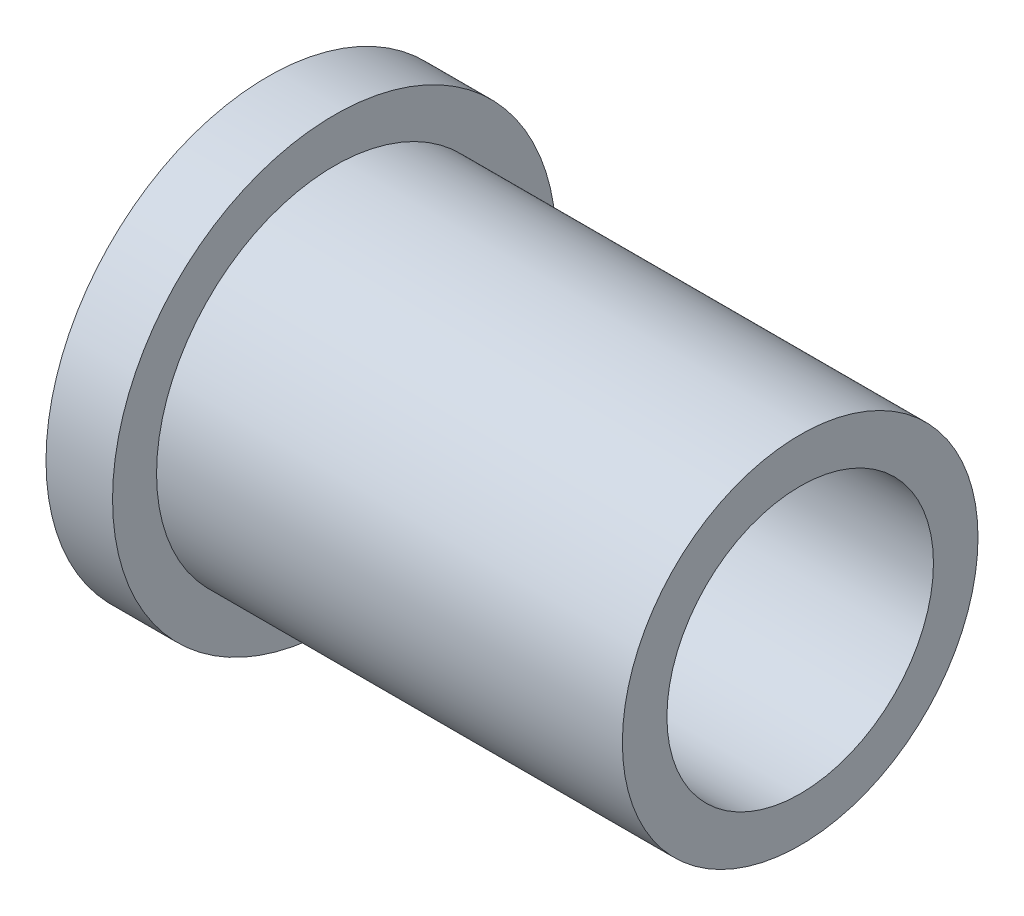
ISO-10303-21;
HEADER;
FILE_DESCRIPTION(('STEP AP214'),'2;1');
FILE_NAME('part.step','',(''),(''),'','','');
FILE_SCHEMA(('AUTOMOTIVE_DESIGN { 1 0 10303 214 1 1 1 1 }'));
ENDSEC;
DATA;
#1=APPLICATION_CONTEXT('core data for automotive mechanical design processes');
#2=APPLICATION_PROTOCOL_DEFINITION('international standard','automotive_design',2000,#1);
#3=PRODUCT_CONTEXT('',#1,'mechanical');
#4=PRODUCT('Part','Part','',(#3));
#5=PRODUCT_RELATED_PRODUCT_CATEGORY('part','',(#4));
#6=PRODUCT_DEFINITION_FORMATION('','',#4);
#7=PRODUCT_DEFINITION_CONTEXT('part definition',#1,'design');
#8=PRODUCT_DEFINITION('design','',#6,#7);
#9=PRODUCT_DEFINITION_SHAPE('','',#8);
#10=(LENGTH_UNIT() NAMED_UNIT(*) SI_UNIT(.MILLI.,.METRE.));
#11=(NAMED_UNIT(*) PLANE_ANGLE_UNIT() SI_UNIT($,.RADIAN.));
#12=(NAMED_UNIT(*) SI_UNIT($,.STERADIAN.) SOLID_ANGLE_UNIT());
#13=UNCERTAINTY_MEASURE_WITH_UNIT(LENGTH_MEASURE(1.E-05),#10,'distance_accuracy_value','');
#14=(GEOMETRIC_REPRESENTATION_CONTEXT(3) GLOBAL_UNCERTAINTY_ASSIGNED_CONTEXT((#13)) GLOBAL_UNIT_ASSIGNED_CONTEXT((#10,
#11,#12)) REPRESENTATION_CONTEXT('',''));
#15=CARTESIAN_POINT('',(0.,0.,0.));
#16=DIRECTION('',(0.,0.,1.));
#17=DIRECTION('',(1.,0.,0.));
#18=AXIS2_PLACEMENT_3D('',#15,#16,#17);
#19=CARTESIAN_POINT('',(4.7625,0.,0.));
#20=DIRECTION('',(1.,0.,0.));
#21=DIRECTION('',(0.,0.,-1.));
#22=AXIS2_PLACEMENT_3D('',#19,#20,#21);
#23=PLANE('',#22);
#24=CARTESIAN_POINT('',(4.7625,0.,0.));
#25=DIRECTION('',(1.,0.,0.));
#26=DIRECTION('',(0.,0.,-1.));
#27=AXIS2_PLACEMENT_3D('',#24,#25,#26);
#28=CIRCLE('',#27,15.875);
#29=CARTESIAN_POINT('',(4.7625,0.,15.875));
#30=VERTEX_POINT('',#29);
#31=EDGE_CURVE('E11',#30,#30,#28,.T.);
#32=ORIENTED_EDGE('',*,*,#31,.T.);
#33=EDGE_LOOP('',(#32));
#34=FACE_BOUND('',#33,.T.);
#35=CARTESIAN_POINT('',(4.7625,0.,0.));
#36=DIRECTION('',(1.,0.,0.));
#37=DIRECTION('',(0.,0.,-1.));
#38=AXIS2_PLACEMENT_3D('',#35,#36,#37);
#39=CIRCLE('',#38,12.7254);
#40=CARTESIAN_POINT('',(4.7625,0.,12.7254));
#41=VERTEX_POINT('',#40);
#42=EDGE_CURVE('E61',#41,#41,#39,.F.);
#43=ORIENTED_EDGE('',*,*,#42,.T.);
#44=EDGE_LOOP('',(#43));
#45=FACE_BOUND('',#44,.T.);
#46=ADVANCED_FACE('F46',(#34,#45),#23,.T.);
#47=CARTESIAN_POINT('',(0.,0.,0.));
#48=DIRECTION('',(1.,0.,0.));
#49=DIRECTION('',(0.,0.,-1.));
#50=AXIS2_PLACEMENT_3D('',#47,#48,#49);
#51=PLANE('',#50);
#52=CARTESIAN_POINT('',(0.,0.,0.));
#53=DIRECTION('',(1.,0.,0.));
#54=DIRECTION('',(0.,0.,-1.));
#55=AXIS2_PLACEMENT_3D('',#52,#53,#54);
#56=CIRCLE('',#55,9.5377);
#57=CARTESIAN_POINT('',(0.,0.,9.5377));
#58=VERTEX_POINT('',#57);
#59=EDGE_CURVE('E57',#58,#58,#56,.T.);
#60=ORIENTED_EDGE('',*,*,#59,.T.);
#61=EDGE_LOOP('',(#60));
#62=FACE_BOUND('',#61,.T.);
#63=CARTESIAN_POINT('',(0.,0.,0.));
#64=DIRECTION('',(1.,0.,0.));
#65=DIRECTION('',(0.,0.,-1.));
#66=AXIS2_PLACEMENT_3D('',#63,#64,#65);
#67=CIRCLE('',#66,15.875);
#68=CARTESIAN_POINT('',(0.,0.,15.875));
#69=VERTEX_POINT('',#68);
#70=EDGE_CURVE('E50',#69,#69,#67,.T.);
#71=ORIENTED_EDGE('',*,*,#70,.F.);
#72=EDGE_LOOP('',(#71));
#73=FACE_BOUND('',#72,.T.);
#74=ADVANCED_FACE('F87',(#62,#73),#51,.F.);
#75=CARTESIAN_POINT('',(4.7625,0.,0.));
#76=DIRECTION('',(-1.,0.,0.));
#77=DIRECTION('',(0.,0.,1.));
#78=AXIS2_PLACEMENT_3D('',#75,#76,#77);
#79=CYLINDRICAL_SURFACE('',#78,15.875);
#80=CARTESIAN_POINT('',(4.7625,0.,15.875));
#81=CARTESIAN_POINT('',(4.712890625,0.,15.875));
#82=CARTESIAN_POINT('',(4.66328125,0.,15.875));
#83=CARTESIAN_POINT('',(4.5640625,0.,15.875));
#84=CARTESIAN_POINT('',(4.514453125,0.,15.875));
#85=CARTESIAN_POINT('',(4.415234375,0.,15.875));
#86=CARTESIAN_POINT('',(4.365625,0.,15.875));
#87=CARTESIAN_POINT('',(4.26640625,0.,15.875));
#88=CARTESIAN_POINT('',(4.216796875,0.,15.875));
#89=CARTESIAN_POINT('',(4.117578125,0.,15.875));
#90=CARTESIAN_POINT('',(4.06796875,0.,15.875));
#91=CARTESIAN_POINT('',(3.96875,0.,15.875));
#92=CARTESIAN_POINT('',(3.919140625,0.,15.875));
#93=CARTESIAN_POINT('',(3.819921875,0.,15.875));
#94=CARTESIAN_POINT('',(3.7703125,0.,15.875));
#95=CARTESIAN_POINT('',(3.67109375,0.,15.875));
#96=CARTESIAN_POINT('',(3.621484375,0.,15.875));
#97=CARTESIAN_POINT('',(3.522265625,0.,15.875));
#98=CARTESIAN_POINT('',(3.47265625,0.,15.875));
#99=CARTESIAN_POINT('',(3.3734375,0.,15.875));
#100=CARTESIAN_POINT('',(3.323828125,0.,15.875));
#101=CARTESIAN_POINT('',(3.224609375,0.,15.875));
#102=CARTESIAN_POINT('',(3.175,0.,15.875));
#103=CARTESIAN_POINT('',(3.07578125,0.,15.875));
#104=CARTESIAN_POINT('',(3.026171875,0.,15.875));
#105=CARTESIAN_POINT('',(2.926953125,0.,15.875));
#106=CARTESIAN_POINT('',(2.87734375,0.,15.875));
#107=CARTESIAN_POINT('',(2.778125,0.,15.875));
#108=CARTESIAN_POINT('',(2.728515625,0.,15.875));
#109=CARTESIAN_POINT('',(2.629296875,0.,15.875));
#110=CARTESIAN_POINT('',(2.5796875,0.,15.875));
#111=CARTESIAN_POINT('',(2.48046875,0.,15.875));
#112=CARTESIAN_POINT('',(2.430859375,0.,15.875));
#113=CARTESIAN_POINT('',(2.331640625,0.,15.875));
#114=CARTESIAN_POINT('',(2.28203125,0.,15.875));
#115=CARTESIAN_POINT('',(2.1828125,0.,15.875));
#116=CARTESIAN_POINT('',(2.133203125,0.,15.875));
#117=CARTESIAN_POINT('',(2.033984375,0.,15.875));
#118=CARTESIAN_POINT('',(1.984375,0.,15.875));
#119=CARTESIAN_POINT('',(1.88515625,0.,15.875));
#120=CARTESIAN_POINT('',(1.835546875,0.,15.875));
#121=CARTESIAN_POINT('',(1.736328125,0.,15.875));
#122=CARTESIAN_POINT('',(1.68671875,0.,15.875));
#123=CARTESIAN_POINT('',(1.5875,0.,15.875));
#124=CARTESIAN_POINT('',(1.537890625,0.,15.875));
#125=CARTESIAN_POINT('',(1.438671875,0.,15.875));
#126=CARTESIAN_POINT('',(1.3890625,0.,15.875));
#127=CARTESIAN_POINT('',(1.28984375,0.,15.875));
#128=CARTESIAN_POINT('',(1.240234375,0.,15.875));
#129=CARTESIAN_POINT('',(1.141015625,0.,15.875));
#130=CARTESIAN_POINT('',(1.09140625,0.,15.875));
#131=CARTESIAN_POINT('',(0.992187499999999,0.,15.875));
#132=CARTESIAN_POINT('',(0.942578124999999,0.,15.875));
#133=CARTESIAN_POINT('',(0.843359375,0.,15.875));
#134=CARTESIAN_POINT('',(0.79375,0.,15.875));
#135=CARTESIAN_POINT('',(0.69453125,0.,15.875));
#136=CARTESIAN_POINT('',(0.644921875,0.,15.875));
#137=CARTESIAN_POINT('',(0.545703125,0.,15.875));
#138=CARTESIAN_POINT('',(0.49609375,0.,15.875));
#139=CARTESIAN_POINT('',(0.396875,0.,15.875));
#140=CARTESIAN_POINT('',(0.347265625,0.,15.875));
#141=CARTESIAN_POINT('',(0.248046875,0.,15.875));
#142=CARTESIAN_POINT('',(0.1984375,0.,15.875));
#143=CARTESIAN_POINT('',(0.09921875,0.,15.875));
#144=CARTESIAN_POINT('',(0.049609375,0.,15.875));
#145=CARTESIAN_POINT('',(0.,0.,15.875));
#146=B_SPLINE_CURVE_WITH_KNOTS('',3,(#80,#81,#82,#83,#84,#85,#86,#87,#88,#89,#90,#91,#92,#93,
#94,#95,#96,#97,#98,#99,#100,#101,#102,#103,#104,#105,#106,#107,#108,#109,#110,#111,#112,#113,
#114,#115,#116,#117,#118,#119,#120,#121,#122,#123,#124,#125,#126,#127,#128,#129,#130,#131,#132,
#133,#134,#135,#136,#137,#138,#139,#140,#141,#142,#143,#144,#145),.UNSPECIFIED.,.F.,.F.,(4,2,2,
2,2,2,2,2,2,2,2,2,2,2,2,2,2,2,2,2,2,2,2,2,2,2,2,2,2,2,2,2,4),(0.,0.148828125,0.29765625,
0.446484375,0.5953125,0.744140625,0.892968750000001,1.041796875,1.190625,1.339453125,1.48828125,
1.637109375,1.7859375,1.934765625,2.08359375,2.232421875,2.38125,2.530078125,2.67890625,
2.827734375,2.9765625,3.125390625,3.27421875,3.423046875,3.571875,3.720703125,3.86953125,
4.018359375,4.1671875,4.316015625,4.46484375,4.613671875,4.7625),.UNSPECIFIED.);
#147=EDGE_CURVE('BSEAM48',#30,#69,#146,.T.);
#148=ORIENTED_EDGE('',*,*,#31,.F.);
#149=ORIENTED_EDGE('',*,*,#70,.T.);
#150=ORIENTED_EDGE('',*,*,#147,.T.);
#151=ORIENTED_EDGE('',*,*,#147,.F.);
#152=EDGE_LOOP('',(#148,#150,#149,#151));
#153=FACE_BOUND('',#152,.T.);
#154=ADVANCED_FACE('F48',(#153),#79,.T.);
#155=CARTESIAN_POINT('',(4.7625,0.,0.));
#156=DIRECTION('',(-1.,0.,0.));
#157=DIRECTION('',(0.,0.,1.));
#158=AXIS2_PLACEMENT_3D('',#155,#156,#157);
#159=CYLINDRICAL_SURFACE('',#158,9.5377);
#160=CARTESIAN_POINT('',(38.1,0.,0.));
#161=DIRECTION('',(1.,0.,0.));
#162=DIRECTION('',(0.,0.,-1.));
#163=AXIS2_PLACEMENT_3D('',#160,#161,#162);
#164=CIRCLE('',#163,9.5377);
#165=CARTESIAN_POINT('',(38.1,0.,9.5377));
#166=VERTEX_POINT('',#165);
#167=EDGE_CURVE('E67',#166,#166,#164,.T.);
#168=CARTESIAN_POINT('',(0.,0.,9.5377));
#169=CARTESIAN_POINT('',(0.396874999999999,0.,9.5377));
#170=CARTESIAN_POINT('',(0.79375,0.,9.5377));
#171=CARTESIAN_POINT('',(1.5875,0.,9.5377));
#172=CARTESIAN_POINT('',(1.984375,0.,9.5377));
#173=CARTESIAN_POINT('',(2.778125,0.,9.5377));
#174=CARTESIAN_POINT('',(3.175,0.,9.5377));
#175=CARTESIAN_POINT('',(3.96875,0.,9.5377));
#176=CARTESIAN_POINT('',(4.365625,0.,9.5377));
#177=CARTESIAN_POINT('',(5.159375,0.,9.5377));
#178=CARTESIAN_POINT('',(5.55625,0.,9.5377));
#179=CARTESIAN_POINT('',(6.35,0.,9.5377));
#180=CARTESIAN_POINT('',(6.746875,0.,9.5377));
#181=CARTESIAN_POINT('',(7.540625,0.,9.5377));
#182=CARTESIAN_POINT('',(7.9375,0.,9.5377));
#183=CARTESIAN_POINT('',(8.73125,0.,9.5377));
#184=CARTESIAN_POINT('',(9.128125,0.,9.5377));
#185=CARTESIAN_POINT('',(9.921875,0.,9.5377));
#186=CARTESIAN_POINT('',(10.31875,0.,9.5377));
#187=CARTESIAN_POINT('',(11.1125,0.,9.5377));
#188=CARTESIAN_POINT('',(11.509375,0.,9.5377));
#189=CARTESIAN_POINT('',(12.303125,0.,9.5377));
#190=CARTESIAN_POINT('',(12.7,0.,9.5377));
#191=CARTESIAN_POINT('',(13.49375,0.,9.5377));
#192=CARTESIAN_POINT('',(13.890625,0.,9.5377));
#193=CARTESIAN_POINT('',(14.684375,0.,9.5377));
#194=CARTESIAN_POINT('',(15.08125,0.,9.5377));
#195=CARTESIAN_POINT('',(15.875,0.,9.5377));
#196=CARTESIAN_POINT('',(16.271875,0.,9.5377));
#197=CARTESIAN_POINT('',(17.065625,0.,9.5377));
#198=CARTESIAN_POINT('',(17.4625,0.,9.5377));
#199=CARTESIAN_POINT('',(18.25625,0.,9.5377));
#200=CARTESIAN_POINT('',(18.653125,0.,9.5377));
#201=CARTESIAN_POINT('',(19.446875,0.,9.5377));
#202=CARTESIAN_POINT('',(19.84375,0.,9.5377));
#203=CARTESIAN_POINT('',(20.6375,0.,9.5377));
#204=CARTESIAN_POINT('',(21.034375,0.,9.5377));
#205=CARTESIAN_POINT('',(21.828125,0.,9.5377));
#206=CARTESIAN_POINT('',(22.225,0.,9.5377));
#207=CARTESIAN_POINT('',(23.01875,0.,9.5377));
#208=CARTESIAN_POINT('',(23.415625,0.,9.5377));
#209=CARTESIAN_POINT('',(24.209375,0.,9.5377));
#210=CARTESIAN_POINT('',(24.60625,0.,9.5377));
#211=CARTESIAN_POINT('',(25.4,0.,9.5377));
#212=CARTESIAN_POINT('',(25.796875,0.,9.5377));
#213=CARTESIAN_POINT('',(26.590625,0.,9.5377));
#214=CARTESIAN_POINT('',(26.9875,0.,9.5377));
#215=CARTESIAN_POINT('',(27.78125,0.,9.5377));
#216=CARTESIAN_POINT('',(28.178125,0.,9.5377));
#217=CARTESIAN_POINT('',(28.971875,0.,9.5377));
#218=CARTESIAN_POINT('',(29.36875,0.,9.5377));
#219=CARTESIAN_POINT('',(30.1625,0.,9.5377));
#220=CARTESIAN_POINT('',(30.559375,0.,9.5377));
#221=CARTESIAN_POINT('',(31.353125,0.,9.5377));
#222=CARTESIAN_POINT('',(31.75,0.,9.5377));
#223=CARTESIAN_POINT('',(32.54375,0.,9.5377));
#224=CARTESIAN_POINT('',(32.940625,0.,9.5377));
#225=CARTESIAN_POINT('',(33.734375,0.,9.5377));
#226=CARTESIAN_POINT('',(34.13125,0.,9.5377));
#227=CARTESIAN_POINT('',(34.925,0.,9.5377));
#228=CARTESIAN_POINT('',(35.321875,0.,9.5377));
#229=CARTESIAN_POINT('',(36.115625,0.,9.5377));
#230=CARTESIAN_POINT('',(36.5125,0.,9.5377));
#231=CARTESIAN_POINT('',(37.30625,0.,9.5377));
#232=CARTESIAN_POINT('',(37.703125,0.,9.5377));
#233=CARTESIAN_POINT('',(38.1,0.,9.5377));
#234=B_SPLINE_CURVE_WITH_KNOTS('',3,(#168,#169,#170,#171,#172,#173,#174,#175,#176,#177,#178,
#179,#180,#181,#182,#183,#184,#185,#186,#187,#188,#189,#190,#191,#192,#193,#194,#195,#196,#197,
#198,#199,#200,#201,#202,#203,#204,#205,#206,#207,#208,#209,#210,#211,#212,#213,#214,#215,#216,
#217,#218,#219,#220,#221,#222,#223,#224,#225,#226,#227,#228,#229,#230,#231,#232,#233),
.UNSPECIFIED.,.F.,.F.,(4,2,2,2,2,2,2,2,2,2,2,2,2,2,2,2,2,2,2,2,2,2,2,2,2,2,2,2,2,2,2,2,4),(0.,
1.190625,2.38125,3.571875,4.7625,5.953125,7.14375,8.334375,9.525,10.715625,11.90625,13.096875,
14.2875,15.478125,16.66875,17.859375,19.05,20.240625,21.43125,22.621875,23.8125,25.003125,
26.19375,27.384375,28.575,29.765625,30.95625,32.146875,33.3375,34.528125,35.71875,36.909375,
38.1),.UNSPECIFIED.);
#235=EDGE_CURVE('BSEAM71',#58,#166,#234,.T.);
#236=ORIENTED_EDGE('',*,*,#59,.F.);
#237=ORIENTED_EDGE('',*,*,#167,.T.);
#238=ORIENTED_EDGE('',*,*,#235,.T.);
#239=ORIENTED_EDGE('',*,*,#235,.F.);
#240=EDGE_LOOP('',(#236,#238,#237,#239));
#241=FACE_BOUND('',#240,.T.);
#242=ADVANCED_FACE('F71',(#241),#159,.F.);
#243=CARTESIAN_POINT('',(38.1,0.,0.));
#244=DIRECTION('',(1.,0.,0.));
#245=DIRECTION('',(0.,0.,-1.));
#246=AXIS2_PLACEMENT_3D('',#243,#244,#245);
#247=PLANE('',#246);
#248=CARTESIAN_POINT('',(38.1,0.,0.));
#249=DIRECTION('',(1.,0.,0.));
#250=DIRECTION('',(0.,0.,-1.));
#251=AXIS2_PLACEMENT_3D('',#248,#249,#250);
#252=CIRCLE('',#251,12.7254);
#253=CARTESIAN_POINT('',(38.1,0.,12.7254));
#254=VERTEX_POINT('',#253);
#255=EDGE_CURVE('E64',#254,#254,#252,.T.);
#256=ORIENTED_EDGE('',*,*,#255,.T.);
#257=EDGE_LOOP('',(#256));
#258=FACE_BOUND('',#257,.T.);
#259=ORIENTED_EDGE('',*,*,#167,.F.);
#260=EDGE_LOOP('',(#259));
#261=FACE_BOUND('',#260,.T.);
#262=ADVANCED_FACE('F73',(#258,#261),#247,.T.);
#263=CARTESIAN_POINT('',(38.1,0.,0.));
#264=DIRECTION('',(-1.,0.,0.));
#265=DIRECTION('',(0.,0.,1.));
#266=AXIS2_PLACEMENT_3D('',#263,#264,#265);
#267=CYLINDRICAL_SURFACE('',#266,12.7254);
#268=CARTESIAN_POINT('',(4.7625,0.,12.7254));
#269=CARTESIAN_POINT('',(5.109765625,0.,12.7254));
#270=CARTESIAN_POINT('',(5.45703125,0.,12.7254));
#271=CARTESIAN_POINT('',(6.1515625,0.,12.7254));
#272=CARTESIAN_POINT('',(6.498828125,0.,12.7254));
#273=CARTESIAN_POINT('',(7.193359375,0.,12.7254));
#274=CARTESIAN_POINT('',(7.540625,0.,12.7254));
#275=CARTESIAN_POINT('',(8.23515625,0.,12.7254));
#276=CARTESIAN_POINT('',(8.582421875,0.,12.7254));
#277=CARTESIAN_POINT('',(9.276953125,0.,12.7254));
#278=CARTESIAN_POINT('',(9.62421875,0.,12.7254));
#279=CARTESIAN_POINT('',(10.31875,0.,12.7254));
#280=CARTESIAN_POINT('',(10.666015625,0.,12.7254));
#281=CARTESIAN_POINT('',(11.360546875,0.,12.7254));
#282=CARTESIAN_POINT('',(11.7078125,0.,12.7254));
#283=CARTESIAN_POINT('',(12.40234375,0.,12.7254));
#284=CARTESIAN_POINT('',(12.749609375,0.,12.7254));
#285=CARTESIAN_POINT('',(13.444140625,0.,12.7254));
#286=CARTESIAN_POINT('',(13.79140625,0.,12.7254));
#287=CARTESIAN_POINT('',(14.4859375,0.,12.7254));
#288=CARTESIAN_POINT('',(14.833203125,0.,12.7254));
#289=CARTESIAN_POINT('',(15.527734375,0.,12.7254));
#290=CARTESIAN_POINT('',(15.875,0.,12.7254));
#291=CARTESIAN_POINT('',(16.56953125,0.,12.7254));
#292=CARTESIAN_POINT('',(16.916796875,0.,12.7254));
#293=CARTESIAN_POINT('',(17.611328125,0.,12.7254));
#294=CARTESIAN_POINT('',(17.95859375,0.,12.7254));
#295=CARTESIAN_POINT('',(18.653125,0.,12.7254));
#296=CARTESIAN_POINT('',(19.000390625,0.,12.7254));
#297=CARTESIAN_POINT('',(19.694921875,0.,12.7254));
#298=CARTESIAN_POINT('',(20.0421875,0.,12.7254));
#299=CARTESIAN_POINT('',(20.73671875,0.,12.7254));
#300=CARTESIAN_POINT('',(21.083984375,0.,12.7254));
#301=CARTESIAN_POINT('',(21.778515625,0.,12.7254));
#302=CARTESIAN_POINT('',(22.12578125,0.,12.7254));
#303=CARTESIAN_POINT('',(22.8203125,0.,12.7254));
#304=CARTESIAN_POINT('',(23.167578125,0.,12.7254));
#305=CARTESIAN_POINT('',(23.862109375,0.,12.7254));
#306=CARTESIAN_POINT('',(24.209375,0.,12.7254));
#307=CARTESIAN_POINT('',(24.90390625,0.,12.7254));
#308=CARTESIAN_POINT('',(25.251171875,0.,12.7254));
#309=CARTESIAN_POINT('',(25.945703125,0.,12.7254));
#310=CARTESIAN_POINT('',(26.29296875,0.,12.7254));
#311=CARTESIAN_POINT('',(26.9875,0.,12.7254));
#312=CARTESIAN_POINT('',(27.334765625,0.,12.7254));
#313=CARTESIAN_POINT('',(28.029296875,0.,12.7254));
#314=CARTESIAN_POINT('',(28.3765625,0.,12.7254));
#315=CARTESIAN_POINT('',(29.07109375,0.,12.7254));
#316=CARTESIAN_POINT('',(29.418359375,0.,12.7254));
#317=CARTESIAN_POINT('',(30.112890625,0.,12.7254));
#318=CARTESIAN_POINT('',(30.46015625,0.,12.7254));
#319=CARTESIAN_POINT('',(31.1546875,0.,12.7254));
#320=CARTESIAN_POINT('',(31.501953125,0.,12.7254));
#321=CARTESIAN_POINT('',(32.196484375,0.,12.7254));
#322=CARTESIAN_POINT('',(32.54375,0.,12.7254));
#323=CARTESIAN_POINT('',(33.23828125,0.,12.7254));
#324=CARTESIAN_POINT('',(33.585546875,0.,12.7254));
#325=CARTESIAN_POINT('',(34.280078125,0.,12.7254));
#326=CARTESIAN_POINT('',(34.62734375,0.,12.7254));
#327=CARTESIAN_POINT('',(35.321875,0.,12.7254));
#328=CARTESIAN_POINT('',(35.669140625,0.,12.7254));
#329=CARTESIAN_POINT('',(36.363671875,0.,12.7254));
#330=CARTESIAN_POINT('',(36.7109375,0.,12.7254));
#331=CARTESIAN_POINT('',(37.40546875,0.,12.7254));
#332=CARTESIAN_POINT('',(37.752734375,0.,12.7254));
#333=CARTESIAN_POINT('',(38.1,0.,12.7254));
#334=B_SPLINE_CURVE_WITH_KNOTS('',3,(#268,#269,#270,#271,#272,#273,#274,#275,#276,#277,#278,
#279,#280,#281,#282,#283,#284,#285,#286,#287,#288,#289,#290,#291,#292,#293,#294,#295,#296,#297,
#298,#299,#300,#301,#302,#303,#304,#305,#306,#307,#308,#309,#310,#311,#312,#313,#314,#315,#316,
#317,#318,#319,#320,#321,#322,#323,#324,#325,#326,#327,#328,#329,#330,#331,#332,#333),
.UNSPECIFIED.,.F.,.F.,(4,2,2,2,2,2,2,2,2,2,2,2,2,2,2,2,2,2,2,2,2,2,2,2,2,2,2,2,2,2,2,2,4),(0.,
1.041796875,2.08359375,3.125390625,4.1671875,5.208984375,6.25078125,7.292578125,
8.33437499999999,9.376171875,10.41796875,11.459765625,12.5015625,13.543359375,14.58515625,
15.626953125,16.66875,17.710546875,18.75234375,19.794140625,20.8359375,21.877734375,22.91953125,
23.961328125,25.003125,26.044921875,27.08671875,28.128515625,29.1703125,30.212109375,
31.25390625,32.295703125,33.3375),.UNSPECIFIED.);
#335=EDGE_CURVE('BSEAM75',#41,#254,#334,.T.);
#336=ORIENTED_EDGE('',*,*,#42,.F.);
#337=ORIENTED_EDGE('',*,*,#255,.F.);
#338=ORIENTED_EDGE('',*,*,#335,.T.);
#339=ORIENTED_EDGE('',*,*,#335,.F.);
#340=EDGE_LOOP('',(#336,#338,#337,#339));
#341=FACE_BOUND('',#340,.T.);
#342=ADVANCED_FACE('F75',(#341),#267,.T.);
#343=CLOSED_SHELL('',(#46,#74,#154,#242,#262,#342));
#344=MANIFOLD_SOLID_BREP('B2',#343);
#345=ADVANCED_BREP_SHAPE_REPRESENTATION('',(#18,#344),#14);
#346=SHAPE_DEFINITION_REPRESENTATION(#9,#345);
ENDSEC;
END-ISO-10303-21;
